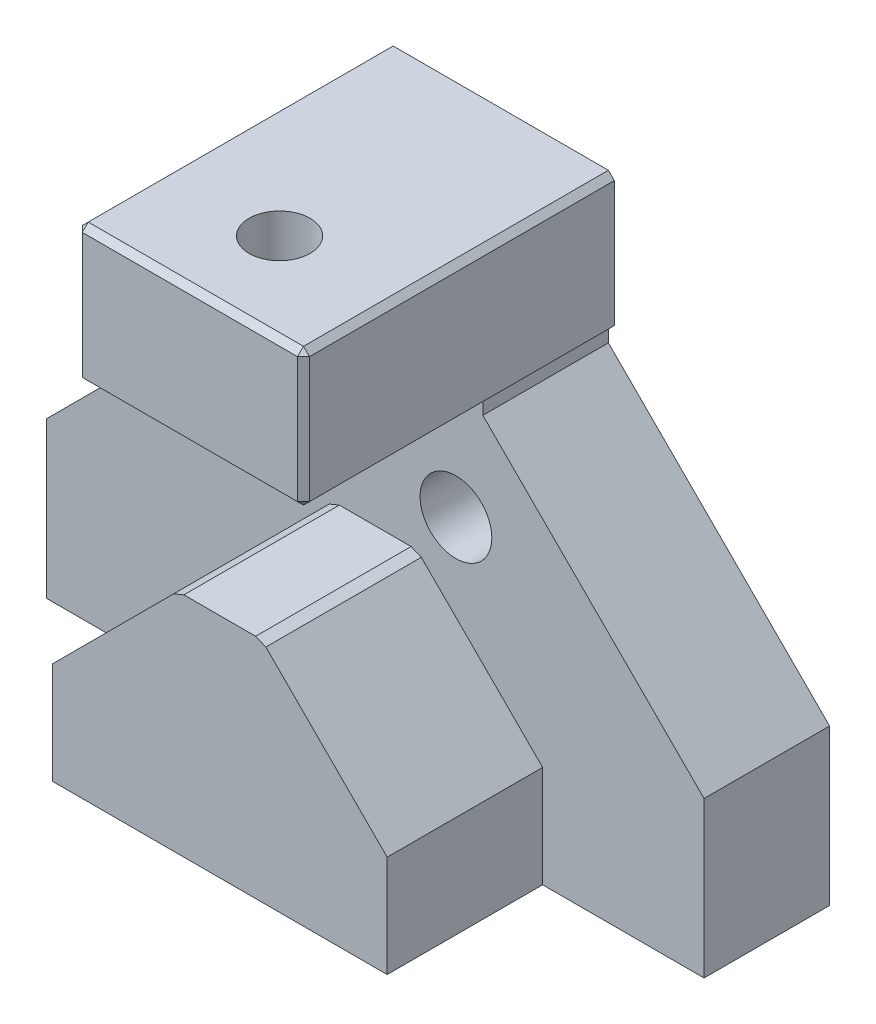
ISO-10303-21;
HEADER;
FILE_DESCRIPTION(('STEP AP214'),'2;1');
FILE_NAME('part.step','',(''),(''),'','','');
FILE_SCHEMA(('AUTOMOTIVE_DESIGN { 1 0 10303 214 1 1 1 1 }'));
ENDSEC;
DATA;
#1=APPLICATION_CONTEXT('core data for automotive mechanical design processes');
#2=APPLICATION_PROTOCOL_DEFINITION('international standard','automotive_design',2000,#1);
#3=PRODUCT_CONTEXT('',#1,'mechanical');
#4=PRODUCT('Part','Part','',(#3));
#5=PRODUCT_RELATED_PRODUCT_CATEGORY('part','',(#4));
#6=PRODUCT_DEFINITION_FORMATION('','',#4);
#7=PRODUCT_DEFINITION_CONTEXT('part definition',#1,'design');
#8=PRODUCT_DEFINITION('design','',#6,#7);
#9=PRODUCT_DEFINITION_SHAPE('','',#8);
#10=(LENGTH_UNIT() NAMED_UNIT(*) SI_UNIT(.MILLI.,.METRE.));
#11=(NAMED_UNIT(*) PLANE_ANGLE_UNIT() SI_UNIT($,.RADIAN.));
#12=(NAMED_UNIT(*) SI_UNIT($,.STERADIAN.) SOLID_ANGLE_UNIT());
#13=UNCERTAINTY_MEASURE_WITH_UNIT(LENGTH_MEASURE(1.E-05),#10,'distance_accuracy_value','');
#14=(GEOMETRIC_REPRESENTATION_CONTEXT(3) GLOBAL_UNCERTAINTY_ASSIGNED_CONTEXT((#13)) GLOBAL_UNIT_ASSIGNED_CONTEXT((#10,
#11,#12)) REPRESENTATION_CONTEXT('',''));
#15=CARTESIAN_POINT('',(0.,0.,0.));
#16=DIRECTION('',(0.,0.,1.));
#17=DIRECTION('',(1.,0.,0.));
#18=AXIS2_PLACEMENT_3D('',#15,#16,#17);
#19=CARTESIAN_POINT('',(-19.,0.,21.));
#20=DIRECTION('',(0.,-1.,0.));
#21=DIRECTION('',(1.,0.,0.));
#22=AXIS2_PLACEMENT_3D('',#19,#20,#21);
#23=PLANE('',#22);
#24=DIRECTION('',(1.,0.,0.));
#25=VECTOR('',#24,1.);
#26=CARTESIAN_POINT('',(-19.,0.,51.));
#27=LINE('',#26,#25);
#28=CARTESIAN_POINT('',(-18.,0.,51.));
#29=VERTEX_POINT('',#28);
#30=CARTESIAN_POINT('',(18.,0.,51.));
#31=VERTEX_POINT('',#30);
#32=EDGE_CURVE('E376',#29,#31,#27,.T.);
#33=ORIENTED_EDGE('',*,*,#32,.T.);
#34=DIRECTION('',(0.,0.,-1.));
#35=VECTOR('',#34,1.);
#36=CARTESIAN_POINT('',(18.,0.,21.));
#37=LINE('',#36,#35);
#38=CARTESIAN_POINT('',(18.,0.,0.));
#39=VERTEX_POINT('',#38);
#40=EDGE_CURVE('E378',#31,#39,#37,.T.);
#41=ORIENTED_EDGE('',*,*,#40,.T.);
#42=DIRECTION('',(-1.,0.,0.));
#43=VECTOR('',#42,1.);
#44=CARTESIAN_POINT('',(-19.,0.,0.));
#45=LINE('',#44,#43);
#46=CARTESIAN_POINT('',(-18.,0.,0.));
#47=VERTEX_POINT('',#46);
#48=EDGE_CURVE('E296',#39,#47,#45,.T.);
#49=ORIENTED_EDGE('',*,*,#48,.T.);
#50=DIRECTION('',(0.,0.,1.));
#51=VECTOR('',#50,1.);
#52=CARTESIAN_POINT('',(-18.,0.,21.));
#53=LINE('',#52,#51);
#54=EDGE_CURVE('E374',#47,#29,#53,.T.);
#55=ORIENTED_EDGE('',*,*,#54,.T.);
#56=EDGE_LOOP('',(#33,#41,#49,#55));
#57=FACE_BOUND('',#56,.T.);
#58=CARTESIAN_POINT('',(0.,0.,37.));
#59=DIRECTION('',(0.,1.,0.));
#60=DIRECTION('',(0.,0.,1.));
#61=AXIS2_PLACEMENT_3D('',#58,#59,#60);
#62=CIRCLE('',#61,5.09999999999999);
#63=CARTESIAN_POINT('',(0.,0.,42.1));
#64=VERTEX_POINT('',#63);
#65=EDGE_CURVE('E964',#64,#64,#62,.T.);
#66=ORIENTED_EDGE('',*,*,#65,.F.);
#67=EDGE_LOOP('',(#66));
#68=FACE_BOUND('',#67,.T.);
#69=ADVANCED_FACE('F53',(#57,#68),#23,.F.);
#70=CARTESIAN_POINT('',(0.,0.,21.));
#71=DIRECTION('',(0.,0.,-1.));
#72=DIRECTION('',(-1.,0.,0.));
#73=AXIS2_PLACEMENT_3D('',#70,#71,#72);
#74=PLANE('',#73);
#75=CARTESIAN_POINT('',(-13.5,-42.,21.));
#76=DIRECTION('',(0.,0.,1.));
#77=DIRECTION('',(1.,0.,0.));
#78=AXIS2_PLACEMENT_3D('',#75,#76,#77);
#79=CIRCLE('',#78,6.);
#80=CARTESIAN_POINT('',(-7.5,-42.,21.));
#81=VERTEX_POINT('',#80);
#82=EDGE_CURVE('E976',#81,#81,#79,.T.);
#83=ORIENTED_EDGE('',*,*,#82,.F.);
#84=EDGE_LOOP('',(#83));
#85=FACE_BOUND('',#84,.T.);
#86=CARTESIAN_POINT('',(13.5,-42.,21.));
#87=DIRECTION('',(0.,0.,1.));
#88=DIRECTION('',(1.,0.,0.));
#89=AXIS2_PLACEMENT_3D('',#86,#87,#88);
#90=CIRCLE('',#89,6.);
#91=CARTESIAN_POINT('',(19.5,-42.,21.));
#92=VERTEX_POINT('',#91);
#93=EDGE_CURVE('E970',#92,#92,#90,.T.);
#94=ORIENTED_EDGE('',*,*,#93,.F.);
#95=EDGE_LOOP('',(#94));
#96=FACE_BOUND('',#95,.T.);
#97=DIRECTION('',(0.,-1.,0.));
#98=VECTOR('',#97,1.);
#99=CARTESIAN_POINT('',(-28.,-71.,21.));
#100=LINE('',#99,#98);
#101=CARTESIAN_POINT('',(-28.,-71.,21.));
#102=VERTEX_POINT('',#101);
#103=CARTESIAN_POINT('',(-28.,-88.,21.));
#104=VERTEX_POINT('',#103);
#105=EDGE_CURVE('E262',#102,#104,#100,.T.);
#106=ORIENTED_EDGE('',*,*,#105,.F.);
#107=DIRECTION('',(-0.707106781186546,-0.707106781186549,0.));
#108=VECTOR('',#107,1.);
#109=CARTESIAN_POINT('',(-7.00000000000008,-50.,21.));
#110=LINE('',#109,#108);
#111=CARTESIAN_POINT('',(-7.70710678118666,-50.7071067811866,21.));
#112=VERTEX_POINT('',#111);
#113=EDGE_CURVE('E237',#112,#102,#110,.T.);
#114=ORIENTED_EDGE('',*,*,#113,.F.);
#115=DIRECTION('',(-0.923879532511287,-0.382683432365089,0.));
#116=VECTOR('',#115,1.);
#117=CARTESIAN_POINT('',(16.7989898732233,-40.5563491861041,21.));
#118=LINE('',#117,#116);
#119=CARTESIAN_POINT('',(-6.00000000000003,-50.,21.));
#120=VERTEX_POINT('',#119);
#121=EDGE_CURVE('E62',#112,#120,#118,.F.);
#122=ORIENTED_EDGE('',*,*,#121,.T.);
#123=DIRECTION('',(-1.,0.,0.));
#124=VECTOR('',#123,1.);
#125=CARTESIAN_POINT('',(-7.00000000000008,-50.,21.));
#126=LINE('',#125,#124);
#127=CARTESIAN_POINT('',(6.00000000000011,-50.,21.));
#128=VERTEX_POINT('',#127);
#129=EDGE_CURVE('E257',#128,#120,#126,.T.);
#130=ORIENTED_EDGE('',*,*,#129,.F.);
#131=DIRECTION('',(-0.923879532511287,0.382683432365091,0.));
#132=VECTOR('',#131,1.);
#133=CARTESIAN_POINT('',(-16.7989898732233,-40.556349186104,21.));
#134=LINE('',#133,#132);
#135=CARTESIAN_POINT('',(7.70710678118663,-50.7071067811865,21.));
#136=VERTEX_POINT('',#135);
#137=EDGE_CURVE('E11',#128,#136,#134,.F.);
#138=ORIENTED_EDGE('',*,*,#137,.T.);
#139=DIRECTION('',(-0.707106781186546,0.707106781186549,0.));
#140=VECTOR('',#139,1.);
#141=CARTESIAN_POINT('',(7.00000000000009,-50.,21.));
#142=LINE('',#141,#140);
#143=CARTESIAN_POINT('',(28.,-71.,21.));
#144=VERTEX_POINT('',#143);
#145=EDGE_CURVE('E255',#144,#136,#142,.T.);
#146=ORIENTED_EDGE('',*,*,#145,.F.);
#147=DIRECTION('',(0.,1.,0.));
#148=VECTOR('',#147,1.);
#149=CARTESIAN_POINT('',(28.,-71.,21.));
#150=LINE('',#149,#148);
#151=CARTESIAN_POINT('',(28.,-88.,21.));
#152=VERTEX_POINT('',#151);
#153=EDGE_CURVE('E264',#152,#144,#150,.T.);
#154=ORIENTED_EDGE('',*,*,#153,.F.);
#155=DIRECTION('',(1.,0.,0.));
#156=VECTOR('',#155,1.);
#157=CARTESIAN_POINT('',(55.,-88.,21.));
#158=LINE('',#157,#156);
#159=CARTESIAN_POINT('',(55.,-88.,21.));
#160=VERTEX_POINT('',#159);
#161=EDGE_CURVE('E284',#152,#160,#158,.T.);
#162=ORIENTED_EDGE('',*,*,#161,.T.);
#163=DIRECTION('',(0.,1.,0.));
#164=VECTOR('',#163,1.);
#165=CARTESIAN_POINT('',(55.,-62.,21.));
#166=LINE('',#165,#164);
#167=CARTESIAN_POINT('',(55.,-62.,21.));
#168=VERTEX_POINT('',#167);
#169=EDGE_CURVE('E287',#160,#168,#166,.T.);
#170=ORIENTED_EDGE('',*,*,#169,.T.);
#171=DIRECTION('',(-0.707106781186546,0.707106781186549,0.));
#172=VECTOR('',#171,1.);
#173=CARTESIAN_POINT('',(18.,-24.9999999999998,21.));
#174=LINE('',#173,#172);
#175=CARTESIAN_POINT('',(18.,-24.9999999999998,21.));
#176=VERTEX_POINT('',#175);
#177=EDGE_CURVE('E289',#168,#176,#174,.T.);
#178=ORIENTED_EDGE('',*,*,#177,.T.);
#179=DIRECTION('',(0.,1.,0.));
#180=VECTOR('',#179,1.);
#181=CARTESIAN_POINT('',(18.,-23.,21.));
#182=LINE('',#181,#180);
#183=CARTESIAN_POINT('',(18.,-23.,21.));
#184=VERTEX_POINT('',#183);
#185=EDGE_CURVE('E291',#176,#184,#182,.T.);
#186=ORIENTED_EDGE('',*,*,#185,.T.);
#187=DIRECTION('',(-1.,0.,0.));
#188=VECTOR('',#187,1.);
#189=CARTESIAN_POINT('',(0.,-23.,21.));
#190=LINE('',#189,#188);
#191=CARTESIAN_POINT('',(-18.,-23.,21.));
#192=VERTEX_POINT('',#191);
#193=EDGE_CURVE('E241',#184,#192,#190,.T.);
#194=ORIENTED_EDGE('',*,*,#193,.T.);
#195=DIRECTION('',(0.,-1.,0.));
#196=VECTOR('',#195,1.);
#197=CARTESIAN_POINT('',(-18.,-23.,21.));
#198=LINE('',#197,#196);
#199=CARTESIAN_POINT('',(-18.,-24.9999999999999,21.));
#200=VERTEX_POINT('',#199);
#201=EDGE_CURVE('E277',#192,#200,#198,.T.);
#202=ORIENTED_EDGE('',*,*,#201,.T.);
#203=DIRECTION('',(-0.707106781186546,-0.707106781186549,0.));
#204=VECTOR('',#203,1.);
#205=CARTESIAN_POINT('',(-18.,-24.9999999999999,21.));
#206=LINE('',#205,#204);
#207=CARTESIAN_POINT('',(-55.,-62.,21.));
#208=VERTEX_POINT('',#207);
#209=EDGE_CURVE('E279',#200,#208,#206,.T.);
#210=ORIENTED_EDGE('',*,*,#209,.T.);
#211=DIRECTION('',(0.,-1.,0.));
#212=VECTOR('',#211,1.);
#213=CARTESIAN_POINT('',(-55.,-62.,21.));
#214=LINE('',#213,#212);
#215=CARTESIAN_POINT('',(-55.,-88.,21.));
#216=VERTEX_POINT('',#215);
#217=EDGE_CURVE('E282',#208,#216,#214,.T.);
#218=ORIENTED_EDGE('',*,*,#217,.T.);
#219=EDGE_CURVE('E285',#216,#104,#158,.T.);
#220=ORIENTED_EDGE('',*,*,#219,.T.);
#221=EDGE_LOOP('',(#106,#114,#122,#130,#138,#146,#154,#162,#170,#178,#186,#194,#202,#210,#218,#220));
#222=FACE_BOUND('',#221,.T.);
#223=ADVANCED_FACE('F424',(#85,#96,#222),#74,.F.);
#224=CARTESIAN_POINT('',(19.,0.,21.));
#225=DIRECTION('',(-1.,0.,0.));
#226=DIRECTION('',(0.,-1.,0.));
#227=AXIS2_PLACEMENT_3D('',#224,#225,#226);
#228=PLANE('',#227);
#229=DIRECTION('',(0.,-1.,0.));
#230=VECTOR('',#229,1.);
#231=CARTESIAN_POINT('',(19.,0.,51.));
#232=LINE('',#231,#230);
#233=CARTESIAN_POINT('',(19.,-1.00000000000001,51.));
#234=VERTEX_POINT('',#233);
#235=CARTESIAN_POINT('',(19.,-22.,51.));
#236=VERTEX_POINT('',#235);
#237=EDGE_CURVE('E370',#234,#236,#232,.T.);
#238=ORIENTED_EDGE('',*,*,#237,.T.);
#239=DIRECTION('',(0.,0.,-1.));
#240=VECTOR('',#239,1.);
#241=CARTESIAN_POINT('',(19.,-22.,21.));
#242=LINE('',#241,#240);
#243=CARTESIAN_POINT('',(19.,-22.,0.));
#244=VERTEX_POINT('',#243);
#245=EDGE_CURVE('E372',#236,#244,#242,.T.);
#246=ORIENTED_EDGE('',*,*,#245,.T.);
#247=DIRECTION('',(0.,1.,0.));
#248=VECTOR('',#247,1.);
#249=CARTESIAN_POINT('',(19.,0.,0.));
#250=LINE('',#249,#248);
#251=CARTESIAN_POINT('',(19.,-1.00000000000001,0.));
#252=VERTEX_POINT('',#251);
#253=EDGE_CURVE('E276',#244,#252,#250,.T.);
#254=ORIENTED_EDGE('',*,*,#253,.T.);
#255=DIRECTION('',(0.,0.,1.));
#256=VECTOR('',#255,1.);
#257=CARTESIAN_POINT('',(19.,-1.00000000000001,21.));
#258=LINE('',#257,#256);
#259=EDGE_CURVE('E368',#252,#234,#258,.T.);
#260=ORIENTED_EDGE('',*,*,#259,.T.);
#261=EDGE_LOOP('',(#238,#246,#254,#260));
#262=FACE_BOUND('',#261,.T.);
#263=ADVANCED_FACE('F450',(#262),#228,.F.);
#264=CARTESIAN_POINT('',(-19.,0.,21.));
#265=DIRECTION('',(1.,0.,0.));
#266=DIRECTION('',(0.,1.,0.));
#267=AXIS2_PLACEMENT_3D('',#264,#265,#266);
#268=PLANE('',#267);
#269=DIRECTION('',(0.,-1.,0.));
#270=VECTOR('',#269,1.);
#271=CARTESIAN_POINT('',(-19.,0.,0.));
#272=LINE('',#271,#270);
#273=CARTESIAN_POINT('',(-19.,-1.00000000000002,0.));
#274=VERTEX_POINT('',#273);
#275=CARTESIAN_POINT('',(-19.,-22.,0.));
#276=VERTEX_POINT('',#275);
#277=EDGE_CURVE('E299',#274,#276,#272,.T.);
#278=ORIENTED_EDGE('',*,*,#277,.T.);
#279=DIRECTION('',(0.,0.,1.));
#280=VECTOR('',#279,1.);
#281=CARTESIAN_POINT('',(-19.,-22.,21.));
#282=LINE('',#281,#280);
#283=CARTESIAN_POINT('',(-19.,-22.,51.));
#284=VERTEX_POINT('',#283);
#285=EDGE_CURVE('E366',#276,#284,#282,.T.);
#286=ORIENTED_EDGE('',*,*,#285,.T.);
#287=DIRECTION('',(0.,1.,0.));
#288=VECTOR('',#287,1.);
#289=CARTESIAN_POINT('',(-19.,0.,51.));
#290=LINE('',#289,#288);
#291=CARTESIAN_POINT('',(-19.,-1.00000000000002,51.));
#292=VERTEX_POINT('',#291);
#293=EDGE_CURVE('E364',#284,#292,#290,.T.);
#294=ORIENTED_EDGE('',*,*,#293,.T.);
#295=DIRECTION('',(0.,0.,-1.));
#296=VECTOR('',#295,1.);
#297=CARTESIAN_POINT('',(-19.,-1.00000000000002,21.));
#298=LINE('',#297,#296);
#299=EDGE_CURVE('E362',#292,#274,#298,.T.);
#300=ORIENTED_EDGE('',*,*,#299,.T.);
#301=EDGE_LOOP('',(#278,#286,#294,#300));
#302=FACE_BOUND('',#301,.T.);
#303=ADVANCED_FACE('F456',(#302),#268,.F.);
#304=CARTESIAN_POINT('',(-18.,-23.,21.));
#305=DIRECTION('',(1.,0.,0.));
#306=DIRECTION('',(0.,0.,-1.));
#307=AXIS2_PLACEMENT_3D('',#304,#305,#306);
#308=PLANE('',#307);
#309=DIRECTION('',(0.,-1.,0.));
#310=VECTOR('',#309,1.);
#311=CARTESIAN_POINT('',(-18.,-23.,0.));
#312=LINE('',#311,#310);
#313=CARTESIAN_POINT('',(-18.,-23.,0.));
#314=VERTEX_POINT('',#313);
#315=CARTESIAN_POINT('',(-18.,-24.9999999999999,0.));
#316=VERTEX_POINT('',#315);
#317=EDGE_CURVE('E302',#314,#316,#312,.T.);
#318=ORIENTED_EDGE('',*,*,#317,.T.);
#319=DIRECTION('',(0.,0.,-1.));
#320=VECTOR('',#319,1.);
#321=CARTESIAN_POINT('',(-18.,-24.9999999999999,21.));
#322=LINE('',#321,#320);
#323=EDGE_CURVE('E333',#200,#316,#322,.T.);
#324=ORIENTED_EDGE('',*,*,#323,.F.);
#325=ORIENTED_EDGE('',*,*,#201,.F.);
#326=DIRECTION('',(0.,0.,-1.));
#327=VECTOR('',#326,1.);
#328=CARTESIAN_POINT('',(-18.,-23.,21.));
#329=LINE('',#328,#327);
#330=EDGE_CURVE('E336',#192,#314,#329,.T.);
#331=ORIENTED_EDGE('',*,*,#330,.T.);
#332=EDGE_LOOP('',(#318,#324,#325,#331));
#333=FACE_BOUND('',#332,.T.);
#334=ADVANCED_FACE('F573',(#333),#308,.F.);
#335=CARTESIAN_POINT('',(-18.,-24.9999999999999,21.));
#336=DIRECTION('',(0.707106781186549,-0.707106781186546,0.));
#337=DIRECTION('',(0.707106781186546,0.707106781186549,0.));
#338=AXIS2_PLACEMENT_3D('',#335,#336,#337);
#339=PLANE('',#338);
#340=DIRECTION('',(-0.707106781186546,-0.707106781186549,0.));
#341=VECTOR('',#340,1.);
#342=CARTESIAN_POINT('',(-18.,-24.9999999999999,0.));
#343=LINE('',#342,#341);
#344=CARTESIAN_POINT('',(-55.,-62.,0.));
#345=VERTEX_POINT('',#344);
#346=EDGE_CURVE('E304',#316,#345,#343,.T.);
#347=ORIENTED_EDGE('',*,*,#346,.T.);
#348=DIRECTION('',(0.,0.,-1.));
#349=VECTOR('',#348,1.);
#350=CARTESIAN_POINT('',(-55.,-62.,21.));
#351=LINE('',#350,#349);
#352=EDGE_CURVE('E330',#208,#345,#351,.T.);
#353=ORIENTED_EDGE('',*,*,#352,.F.);
#354=ORIENTED_EDGE('',*,*,#209,.F.);
#355=ORIENTED_EDGE('',*,*,#323,.T.);
#356=EDGE_LOOP('',(#347,#353,#354,#355));
#357=FACE_BOUND('',#356,.T.);
#358=ADVANCED_FACE('F570',(#357),#339,.F.);
#359=CARTESIAN_POINT('',(-55.,-62.,21.));
#360=DIRECTION('',(1.,0.,0.));
#361=DIRECTION('',(0.,1.,0.));
#362=AXIS2_PLACEMENT_3D('',#359,#360,#361);
#363=PLANE('',#362);
#364=DIRECTION('',(0.,-1.,0.));
#365=VECTOR('',#364,1.);
#366=CARTESIAN_POINT('',(-55.,-62.,0.));
#367=LINE('',#366,#365);
#368=CARTESIAN_POINT('',(-55.,-88.,0.));
#369=VERTEX_POINT('',#368);
#370=EDGE_CURVE('E306',#345,#369,#367,.T.);
#371=ORIENTED_EDGE('',*,*,#370,.T.);
#372=DIRECTION('',(0.,0.,-1.));
#373=VECTOR('',#372,1.);
#374=CARTESIAN_POINT('',(-55.,-88.,21.));
#375=LINE('',#374,#373);
#376=EDGE_CURVE('E327',#216,#369,#375,.T.);
#377=ORIENTED_EDGE('',*,*,#376,.F.);
#378=ORIENTED_EDGE('',*,*,#217,.F.);
#379=ORIENTED_EDGE('',*,*,#352,.T.);
#380=EDGE_LOOP('',(#371,#377,#378,#379));
#381=FACE_BOUND('',#380,.T.);
#382=ADVANCED_FACE('F565',(#381),#363,.F.);
#383=CARTESIAN_POINT('',(55.,-88.,21.));
#384=DIRECTION('',(0.,1.,0.));
#385=DIRECTION('',(-1.,0.,0.));
#386=AXIS2_PLACEMENT_3D('',#383,#384,#385);
#387=PLANE('',#386);
#388=DIRECTION('',(1.,0.,0.));
#389=VECTOR('',#388,1.);
#390=CARTESIAN_POINT('',(55.,-88.,0.));
#391=LINE('',#390,#389);
#392=CARTESIAN_POINT('',(55.,-88.,0.));
#393=VERTEX_POINT('',#392);
#394=EDGE_CURVE('E308',#369,#393,#391,.T.);
#395=ORIENTED_EDGE('',*,*,#394,.T.);
#396=DIRECTION('',(0.,0.,-1.));
#397=VECTOR('',#396,1.);
#398=CARTESIAN_POINT('',(55.,-88.,21.));
#399=LINE('',#398,#397);
#400=EDGE_CURVE('E324',#160,#393,#399,.T.);
#401=ORIENTED_EDGE('',*,*,#400,.F.);
#402=ORIENTED_EDGE('',*,*,#161,.F.);
#403=DIRECTION('',(0.,0.,-1.));
#404=VECTOR('',#403,1.);
#405=CARTESIAN_POINT('',(28.,-88.,47.));
#406=LINE('',#405,#404);
#407=CARTESIAN_POINT('',(28.,-88.,47.));
#408=VERTEX_POINT('',#407);
#409=EDGE_CURVE('E270',#408,#152,#406,.T.);
#410=ORIENTED_EDGE('',*,*,#409,.F.);
#411=DIRECTION('',(1.,0.,0.));
#412=VECTOR('',#411,1.);
#413=CARTESIAN_POINT('',(28.,-88.,47.));
#414=LINE('',#413,#412);
#415=CARTESIAN_POINT('',(-28.,-88.,47.));
#416=VERTEX_POINT('',#415);
#417=EDGE_CURVE('E247',#416,#408,#414,.T.);
#418=ORIENTED_EDGE('',*,*,#417,.F.);
#419=DIRECTION('',(0.,0.,-1.));
#420=VECTOR('',#419,1.);
#421=CARTESIAN_POINT('',(-28.,-88.,47.));
#422=LINE('',#421,#420);
#423=EDGE_CURVE('E242',#416,#104,#422,.T.);
#424=ORIENTED_EDGE('',*,*,#423,.T.);
#425=ORIENTED_EDGE('',*,*,#219,.F.);
#426=ORIENTED_EDGE('',*,*,#376,.T.);
#427=EDGE_LOOP('',(#395,#401,#402,#410,#418,#424,#425,#426));
#428=FACE_BOUND('',#427,.T.);
#429=ADVANCED_FACE('F558',(#428),#387,.F.);
#430=CARTESIAN_POINT('',(55.,-62.,21.));
#431=DIRECTION('',(-1.,0.,0.));
#432=DIRECTION('',(0.,-1.,0.));
#433=AXIS2_PLACEMENT_3D('',#430,#431,#432);
#434=PLANE('',#433);
#435=DIRECTION('',(0.,1.,0.));
#436=VECTOR('',#435,1.);
#437=CARTESIAN_POINT('',(55.,-62.,0.));
#438=LINE('',#437,#436);
#439=CARTESIAN_POINT('',(55.,-62.,0.));
#440=VERTEX_POINT('',#439);
#441=EDGE_CURVE('E310',#393,#440,#438,.T.);
#442=ORIENTED_EDGE('',*,*,#441,.T.);
#443=DIRECTION('',(0.,0.,-1.));
#444=VECTOR('',#443,1.);
#445=CARTESIAN_POINT('',(55.,-62.,21.));
#446=LINE('',#445,#444);
#447=EDGE_CURVE('E321',#168,#440,#446,.T.);
#448=ORIENTED_EDGE('',*,*,#447,.F.);
#449=ORIENTED_EDGE('',*,*,#169,.F.);
#450=ORIENTED_EDGE('',*,*,#400,.T.);
#451=EDGE_LOOP('',(#442,#448,#449,#450));
#452=FACE_BOUND('',#451,.T.);
#453=ADVANCED_FACE('F554',(#452),#434,.F.);
#454=CARTESIAN_POINT('',(18.,-24.9999999999998,21.));
#455=DIRECTION('',(-0.707106781186549,-0.707106781186546,0.));
#456=DIRECTION('',(0.707106781186546,-0.707106781186549,0.));
#457=AXIS2_PLACEMENT_3D('',#454,#455,#456);
#458=PLANE('',#457);
#459=DIRECTION('',(-0.707106781186546,0.707106781186549,0.));
#460=VECTOR('',#459,1.);
#461=CARTESIAN_POINT('',(18.,-24.9999999999998,0.));
#462=LINE('',#461,#460);
#463=CARTESIAN_POINT('',(18.,-24.9999999999998,0.));
#464=VERTEX_POINT('',#463);
#465=EDGE_CURVE('E312',#440,#464,#462,.T.);
#466=ORIENTED_EDGE('',*,*,#465,.T.);
#467=DIRECTION('',(0.,0.,-1.));
#468=VECTOR('',#467,1.);
#469=CARTESIAN_POINT('',(18.,-24.9999999999998,21.));
#470=LINE('',#469,#468);
#471=EDGE_CURVE('E318',#176,#464,#470,.T.);
#472=ORIENTED_EDGE('',*,*,#471,.F.);
#473=ORIENTED_EDGE('',*,*,#177,.F.);
#474=ORIENTED_EDGE('',*,*,#447,.T.);
#475=EDGE_LOOP('',(#466,#472,#473,#474));
#476=FACE_BOUND('',#475,.T.);
#477=ADVANCED_FACE('F549',(#476),#458,.F.);
#478=CARTESIAN_POINT('',(18.,-23.,21.));
#479=DIRECTION('',(-1.,0.,0.));
#480=DIRECTION('',(0.,0.,1.));
#481=AXIS2_PLACEMENT_3D('',#478,#479,#480);
#482=PLANE('',#481);
#483=DIRECTION('',(0.,1.,0.));
#484=VECTOR('',#483,1.);
#485=CARTESIAN_POINT('',(18.,-23.,0.));
#486=LINE('',#485,#484);
#487=CARTESIAN_POINT('',(18.,-23.,0.));
#488=VERTEX_POINT('',#487);
#489=EDGE_CURVE('E280',#464,#488,#486,.T.);
#490=ORIENTED_EDGE('',*,*,#489,.T.);
#491=DIRECTION('',(0.,0.,-1.));
#492=VECTOR('',#491,1.);
#493=CARTESIAN_POINT('',(18.,-23.,21.));
#494=LINE('',#493,#492);
#495=EDGE_CURVE('E293',#184,#488,#494,.T.);
#496=ORIENTED_EDGE('',*,*,#495,.F.);
#497=ORIENTED_EDGE('',*,*,#185,.F.);
#498=ORIENTED_EDGE('',*,*,#471,.T.);
#499=EDGE_LOOP('',(#490,#496,#497,#498));
#500=FACE_BOUND('',#499,.T.);
#501=ADVANCED_FACE('F542',(#500),#482,.F.);
#502=CARTESIAN_POINT('',(19.,-23.,21.));
#503=DIRECTION('',(0.,1.,0.));
#504=DIRECTION('',(0.,0.,1.));
#505=AXIS2_PLACEMENT_3D('',#502,#503,#504);
#506=PLANE('',#505);
#507=CARTESIAN_POINT('',(0.,-23.,37.));
#508=DIRECTION('',(0.,1.,0.));
#509=DIRECTION('',(0.,0.,1.));
#510=AXIS2_PLACEMENT_3D('',#507,#508,#509);
#511=CIRCLE('',#510,5.09999999999999);
#512=CARTESIAN_POINT('',(0.,-23.,42.1));
#513=VERTEX_POINT('',#512);
#514=EDGE_CURVE('E384',#513,#513,#511,.T.);
#515=ORIENTED_EDGE('',*,*,#514,.T.);
#516=EDGE_LOOP('',(#515));
#517=FACE_BOUND('',#516,.T.);
#518=DIRECTION('',(-1.,0.,0.));
#519=VECTOR('',#518,1.);
#520=CARTESIAN_POINT('',(19.,-23.,51.));
#521=LINE('',#520,#519);
#522=CARTESIAN_POINT('',(18.,-23.,51.));
#523=VERTEX_POINT('',#522);
#524=CARTESIAN_POINT('',(-18.,-23.,51.));
#525=VERTEX_POINT('',#524);
#526=EDGE_CURVE('E340',#523,#525,#521,.T.);
#527=ORIENTED_EDGE('',*,*,#526,.T.);
#528=DIRECTION('',(0.,0.,-1.));
#529=VECTOR('',#528,1.);
#530=CARTESIAN_POINT('',(-18.,-23.,21.));
#531=LINE('',#530,#529);
#532=EDGE_CURVE('E343',#525,#192,#531,.T.);
#533=ORIENTED_EDGE('',*,*,#532,.T.);
#534=ORIENTED_EDGE('',*,*,#193,.F.);
#535=DIRECTION('',(0.,0.,1.));
#536=VECTOR('',#535,1.);
#537=CARTESIAN_POINT('',(18.,-23.,21.));
#538=LINE('',#537,#536);
#539=EDGE_CURVE('E338',#184,#523,#538,.T.);
#540=ORIENTED_EDGE('',*,*,#539,.T.);
#541=EDGE_LOOP('',(#527,#533,#534,#540));
#542=FACE_BOUND('',#541,.T.);
#543=ADVANCED_FACE('F535',(#517,#542),#506,.F.);
#544=CARTESIAN_POINT('',(0.,0.,0.));
#545=DIRECTION('',(0.,0.,-1.));
#546=DIRECTION('',(-1.,0.,0.));
#547=AXIS2_PLACEMENT_3D('',#544,#545,#546);
#548=PLANE('',#547);
#549=CARTESIAN_POINT('',(-13.5,-42.,0.));
#550=DIRECTION('',(0.,0.,1.));
#551=DIRECTION('',(1.,0.,0.));
#552=AXIS2_PLACEMENT_3D('',#549,#550,#551);
#553=CIRCLE('',#552,5.99999999999999);
#554=CARTESIAN_POINT('',(-7.5,-42.,0.));
#555=VERTEX_POINT('',#554);
#556=EDGE_CURVE('E973',#555,#555,#553,.T.);
#557=ORIENTED_EDGE('',*,*,#556,.T.);
#558=EDGE_LOOP('',(#557));
#559=FACE_BOUND('',#558,.T.);
#560=CARTESIAN_POINT('',(13.5,-42.,0.));
#561=DIRECTION('',(0.,0.,1.));
#562=DIRECTION('',(1.,0.,0.));
#563=AXIS2_PLACEMENT_3D('',#560,#561,#562);
#564=CIRCLE('',#563,5.99999999999999);
#565=CARTESIAN_POINT('',(19.5,-42.,0.));
#566=VERTEX_POINT('',#565);
#567=EDGE_CURVE('E967',#566,#566,#564,.T.);
#568=ORIENTED_EDGE('',*,*,#567,.T.);
#569=EDGE_LOOP('',(#568));
#570=FACE_BOUND('',#569,.T.);
#571=ORIENTED_EDGE('',*,*,#317,.F.);
#572=DIRECTION('',(0.707106781186546,-0.707106781186549,0.));
#573=VECTOR('',#572,1.);
#574=CARTESIAN_POINT('',(-20.5,-20.5,0.));
#575=LINE('',#574,#573);
#576=EDGE_CURVE('E360',#314,#276,#575,.F.);
#577=ORIENTED_EDGE('',*,*,#576,.T.);
#578=ORIENTED_EDGE('',*,*,#277,.F.);
#579=DIRECTION('',(-0.707106781186548,-0.707106781186547,0.));
#580=VECTOR('',#579,1.);
#581=CARTESIAN_POINT('',(-8.99999999999998,8.99999999999999,0.));
#582=LINE('',#581,#580);
#583=EDGE_CURVE('E354',#274,#47,#582,.F.);
#584=ORIENTED_EDGE('',*,*,#583,.T.);
#585=ORIENTED_EDGE('',*,*,#48,.F.);
#586=DIRECTION('',(-0.70710678118655,0.707106781186545,0.));
#587=VECTOR('',#586,1.);
#588=CARTESIAN_POINT('',(8.99999999999991,8.99999999999999,0.));
#589=LINE('',#588,#587);
#590=EDGE_CURVE('E356',#39,#252,#589,.F.);
#591=ORIENTED_EDGE('',*,*,#590,.T.);
#592=ORIENTED_EDGE('',*,*,#253,.F.);
#593=DIRECTION('',(0.707106781186546,0.707106781186549,0.));
#594=VECTOR('',#593,1.);
#595=CARTESIAN_POINT('',(20.5,-20.5,0.));
#596=LINE('',#595,#594);
#597=EDGE_CURVE('E358',#244,#488,#596,.F.);
#598=ORIENTED_EDGE('',*,*,#597,.T.);
#599=ORIENTED_EDGE('',*,*,#489,.F.);
#600=ORIENTED_EDGE('',*,*,#465,.F.);
#601=ORIENTED_EDGE('',*,*,#441,.F.);
#602=ORIENTED_EDGE('',*,*,#394,.F.);
#603=ORIENTED_EDGE('',*,*,#370,.F.);
#604=ORIENTED_EDGE('',*,*,#346,.F.);
#605=EDGE_LOOP('',(#571,#577,#578,#584,#585,#591,#592,#598,#599,#600,#601,#602,#603,#604));
#606=FACE_BOUND('',#605,.T.);
#607=ADVANCED_FACE('F522',(#559,#570,#606),#548,.T.);
#608=CARTESIAN_POINT('',(0.,0.,52.));
#609=DIRECTION('',(0.,0.,-1.));
#610=DIRECTION('',(-1.,0.,0.));
#611=AXIS2_PLACEMENT_3D('',#608,#609,#610);
#612=PLANE('',#611);
#613=DIRECTION('',(0.,-1.,0.));
#614=VECTOR('',#613,1.);
#615=CARTESIAN_POINT('',(-18.,0.,52.));
#616=LINE('',#615,#614);
#617=CARTESIAN_POINT('',(-18.,-1.00000000000002,52.));
#618=VERTEX_POINT('',#617);
#619=CARTESIAN_POINT('',(-18.,-22.,52.));
#620=VERTEX_POINT('',#619);
#621=EDGE_CURVE('E349',#618,#620,#616,.T.);
#622=ORIENTED_EDGE('',*,*,#621,.T.);
#623=DIRECTION('',(1.,0.,0.));
#624=VECTOR('',#623,1.);
#625=CARTESIAN_POINT('',(0.,-22.,52.));
#626=LINE('',#625,#624);
#627=CARTESIAN_POINT('',(18.,-22.,52.));
#628=VERTEX_POINT('',#627);
#629=EDGE_CURVE('E351',#620,#628,#626,.T.);
#630=ORIENTED_EDGE('',*,*,#629,.T.);
#631=DIRECTION('',(0.,1.,0.));
#632=VECTOR('',#631,1.);
#633=CARTESIAN_POINT('',(18.,0.,52.));
#634=LINE('',#633,#632);
#635=CARTESIAN_POINT('',(18.,-1.00000000000001,52.));
#636=VERTEX_POINT('',#635);
#637=EDGE_CURVE('E347',#628,#636,#634,.T.);
#638=ORIENTED_EDGE('',*,*,#637,.T.);
#639=DIRECTION('',(-1.,0.,0.));
#640=VECTOR('',#639,1.);
#641=CARTESIAN_POINT('',(0.,-1.00000000000002,52.));
#642=LINE('',#641,#640);
#643=EDGE_CURVE('E345',#636,#618,#642,.T.);
#644=ORIENTED_EDGE('',*,*,#643,.T.);
#645=EDGE_LOOP('',(#622,#630,#638,#644));
#646=FACE_BOUND('',#645,.T.);
#647=ADVANCED_FACE('F593',(#646),#612,.F.);
#648=CARTESIAN_POINT('',(7.00000000000009,-50.,47.));
#649=DIRECTION('',(-0.707106781186549,-0.707106781186546,0.));
#650=DIRECTION('',(0.707106781186546,-0.707106781186549,0.));
#651=AXIS2_PLACEMENT_3D('',#648,#649,#650);
#652=PLANE('',#651);
#653=ORIENTED_EDGE('',*,*,#145,.T.);
#654=DIRECTION('',(0.,0.,1.));
#655=VECTOR('',#654,1.);
#656=CARTESIAN_POINT('',(7.70710678118663,-50.7071067811865,47.));
#657=LINE('',#656,#655);
#658=CARTESIAN_POINT('',(7.70710678118663,-50.7071067811865,47.));
#659=VERTEX_POINT('',#658);
#660=EDGE_CURVE('E74',#136,#659,#657,.T.);
#661=ORIENTED_EDGE('',*,*,#660,.T.);
#662=DIRECTION('',(-0.707106781186546,0.707106781186549,0.));
#663=VECTOR('',#662,1.);
#664=CARTESIAN_POINT('',(7.00000000000009,-50.,47.));
#665=LINE('',#664,#663);
#666=CARTESIAN_POINT('',(28.,-71.,47.));
#667=VERTEX_POINT('',#666);
#668=EDGE_CURVE('E267',#667,#659,#665,.T.);
#669=ORIENTED_EDGE('',*,*,#668,.F.);
#670=DIRECTION('',(0.,0.,-1.));
#671=VECTOR('',#670,1.);
#672=CARTESIAN_POINT('',(28.,-71.,47.));
#673=LINE('',#672,#671);
#674=EDGE_CURVE('E254',#667,#144,#673,.T.);
#675=ORIENTED_EDGE('',*,*,#674,.T.);
#676=EDGE_LOOP('',(#653,#661,#669,#675));
#677=FACE_BOUND('',#676,.T.);
#678=ADVANCED_FACE('F595',(#677),#652,.F.);
#679=CARTESIAN_POINT('',(-7.00000000000008,-50.,47.));
#680=DIRECTION('',(0.,-1.,0.));
#681=DIRECTION('',(0.,0.,-1.));
#682=AXIS2_PLACEMENT_3D('',#679,#680,#681);
#683=PLANE('',#682);
#684=ORIENTED_EDGE('',*,*,#129,.T.);
#685=DIRECTION('',(0.,0.,1.));
#686=VECTOR('',#685,1.);
#687=CARTESIAN_POINT('',(-6.00000000000003,-50.,47.));
#688=LINE('',#687,#686);
#689=CARTESIAN_POINT('',(-6.00000000000003,-50.,47.));
#690=VERTEX_POINT('',#689);
#691=EDGE_CURVE('E419',#120,#690,#688,.T.);
#692=ORIENTED_EDGE('',*,*,#691,.T.);
#693=DIRECTION('',(-1.,0.,0.));
#694=VECTOR('',#693,1.);
#695=CARTESIAN_POINT('',(-7.00000000000008,-50.,47.));
#696=LINE('',#695,#694);
#697=CARTESIAN_POINT('',(6.00000000000011,-50.,47.));
#698=VERTEX_POINT('',#697);
#699=EDGE_CURVE('E231',#698,#690,#696,.T.);
#700=ORIENTED_EDGE('',*,*,#699,.F.);
#701=DIRECTION('',(0.,0.,-1.));
#702=VECTOR('',#701,1.);
#703=CARTESIAN_POINT('',(6.00000000000011,-50.,47.));
#704=LINE('',#703,#702);
#705=EDGE_CURVE('E416',#698,#128,#704,.T.);
#706=ORIENTED_EDGE('',*,*,#705,.T.);
#707=EDGE_LOOP('',(#684,#692,#700,#706));
#708=FACE_BOUND('',#707,.T.);
#709=ADVANCED_FACE('F428',(#708),#683,.F.);
#710=CARTESIAN_POINT('',(-7.00000000000008,-50.,47.));
#711=DIRECTION('',(0.707106781186549,-0.707106781186546,0.));
#712=DIRECTION('',(0.707106781186546,0.707106781186549,0.));
#713=AXIS2_PLACEMENT_3D('',#710,#711,#712);
#714=PLANE('',#713);
#715=DIRECTION('',(-0.707106781186546,-0.707106781186549,0.));
#716=VECTOR('',#715,1.);
#717=CARTESIAN_POINT('',(-7.00000000000008,-50.,47.));
#718=LINE('',#717,#716);
#719=CARTESIAN_POINT('',(-7.70710678118666,-50.7071067811866,47.));
#720=VERTEX_POINT('',#719);
#721=CARTESIAN_POINT('',(-28.,-71.,47.));
#722=VERTEX_POINT('',#721);
#723=EDGE_CURVE('E219',#720,#722,#718,.T.);
#724=ORIENTED_EDGE('',*,*,#723,.F.);
#725=DIRECTION('',(0.,0.,-1.));
#726=VECTOR('',#725,1.);
#727=CARTESIAN_POINT('',(-7.70710678118666,-50.7071067811866,47.));
#728=LINE('',#727,#726);
#729=EDGE_CURVE('E380',#720,#112,#728,.T.);
#730=ORIENTED_EDGE('',*,*,#729,.T.);
#731=ORIENTED_EDGE('',*,*,#113,.T.);
#732=DIRECTION('',(0.,0.,-1.));
#733=VECTOR('',#732,1.);
#734=CARTESIAN_POINT('',(-28.,-71.,47.));
#735=LINE('',#734,#733);
#736=EDGE_CURVE('E234',#722,#102,#735,.T.);
#737=ORIENTED_EDGE('',*,*,#736,.F.);
#738=EDGE_LOOP('',(#724,#730,#731,#737));
#739=FACE_BOUND('',#738,.T.);
#740=ADVANCED_FACE('F235',(#739),#714,.F.);
#741=CARTESIAN_POINT('',(-28.,-71.,47.));
#742=DIRECTION('',(1.,0.,0.));
#743=DIRECTION('',(0.,1.,0.));
#744=AXIS2_PLACEMENT_3D('',#741,#742,#743);
#745=PLANE('',#744);
#746=ORIENTED_EDGE('',*,*,#105,.T.);
#747=ORIENTED_EDGE('',*,*,#423,.F.);
#748=DIRECTION('',(0.,-1.,0.));
#749=VECTOR('',#748,1.);
#750=CARTESIAN_POINT('',(-28.,-71.,47.));
#751=LINE('',#750,#749);
#752=EDGE_CURVE('E224',#722,#416,#751,.T.);
#753=ORIENTED_EDGE('',*,*,#752,.F.);
#754=ORIENTED_EDGE('',*,*,#736,.T.);
#755=EDGE_LOOP('',(#746,#747,#753,#754));
#756=FACE_BOUND('',#755,.T.);
#757=ADVANCED_FACE('F244',(#756),#745,.F.);
#758=CARTESIAN_POINT('',(28.,-71.,47.));
#759=DIRECTION('',(-1.,0.,0.));
#760=DIRECTION('',(0.,-1.,0.));
#761=AXIS2_PLACEMENT_3D('',#758,#759,#760);
#762=PLANE('',#761);
#763=ORIENTED_EDGE('',*,*,#153,.T.);
#764=ORIENTED_EDGE('',*,*,#674,.F.);
#765=DIRECTION('',(0.,1.,0.));
#766=VECTOR('',#765,1.);
#767=CARTESIAN_POINT('',(28.,-71.,47.));
#768=LINE('',#767,#766);
#769=EDGE_CURVE('E249',#408,#667,#768,.T.);
#770=ORIENTED_EDGE('',*,*,#769,.F.);
#771=ORIENTED_EDGE('',*,*,#409,.T.);
#772=EDGE_LOOP('',(#763,#764,#770,#771));
#773=FACE_BOUND('',#772,.T.);
#774=ADVANCED_FACE('F511',(#773),#762,.F.);
#775=CARTESIAN_POINT('',(0.,0.,47.));
#776=DIRECTION('',(0.,0.,-1.));
#777=DIRECTION('',(-1.,0.,0.));
#778=AXIS2_PLACEMENT_3D('',#775,#776,#777);
#779=PLANE('',#778);
#780=ORIENTED_EDGE('',*,*,#699,.T.);
#781=DIRECTION('',(0.923879532511287,0.382683432365089,0.));
#782=VECTOR('',#781,1.);
#783=CARTESIAN_POINT('',(-7.70710678118666,-50.7071067811866,47.));
#784=LINE('',#783,#782);
#785=EDGE_CURVE('E227',#690,#720,#784,.F.);
#786=ORIENTED_EDGE('',*,*,#785,.T.);
#787=ORIENTED_EDGE('',*,*,#723,.T.);
#788=ORIENTED_EDGE('',*,*,#752,.T.);
#789=ORIENTED_EDGE('',*,*,#417,.T.);
#790=ORIENTED_EDGE('',*,*,#769,.T.);
#791=ORIENTED_EDGE('',*,*,#668,.T.);
#792=DIRECTION('',(0.923879532511287,-0.382683432365091,0.));
#793=VECTOR('',#792,1.);
#794=CARTESIAN_POINT('',(6.00000000000011,-50.,47.));
#795=LINE('',#794,#793);
#796=EDGE_CURVE('E421',#659,#698,#795,.F.);
#797=ORIENTED_EDGE('',*,*,#796,.T.);
#798=EDGE_LOOP('',(#780,#786,#787,#788,#789,#790,#791,#797));
#799=FACE_BOUND('',#798,.T.);
#800=ADVANCED_FACE('F222',(#799),#779,.F.);
#801=CARTESIAN_POINT('',(18.,0.,21.));
#802=DIRECTION('',(-0.707106781186545,-0.70710678118655,0.));
#803=DIRECTION('',(0.,0.,-1.));
#804=AXIS2_PLACEMENT_3D('',#801,#802,#803);
#805=PLANE('',#804);
#806=ORIENTED_EDGE('',*,*,#590,.F.);
#807=ORIENTED_EDGE('',*,*,#40,.F.);
#808=DIRECTION('',(0.70710678118655,-0.707106781186545,0.));
#809=VECTOR('',#808,1.);
#810=CARTESIAN_POINT('',(18.5,-0.500000000000008,51.));
#811=LINE('',#810,#809);
#812=EDGE_CURVE('E410',#234,#31,#811,.F.);
#813=ORIENTED_EDGE('',*,*,#812,.F.);
#814=ORIENTED_EDGE('',*,*,#259,.F.);
#815=EDGE_LOOP('',(#806,#807,#813,#814));
#816=FACE_BOUND('',#815,.T.);
#817=ADVANCED_FACE('F504',(#816),#805,.F.);
#818=CARTESIAN_POINT('',(-19.,-1.00000000000002,21.));
#819=DIRECTION('',(0.707106781186547,-0.707106781186548,0.));
#820=DIRECTION('',(0.,0.,-1.));
#821=AXIS2_PLACEMENT_3D('',#818,#819,#820);
#822=PLANE('',#821);
#823=ORIENTED_EDGE('',*,*,#583,.F.);
#824=ORIENTED_EDGE('',*,*,#299,.F.);
#825=DIRECTION('',(0.707106781186548,0.707106781186547,0.));
#826=VECTOR('',#825,1.);
#827=CARTESIAN_POINT('',(-19.,-1.00000000000002,51.));
#828=LINE('',#827,#826);
#829=EDGE_CURVE('E407',#29,#292,#828,.F.);
#830=ORIENTED_EDGE('',*,*,#829,.F.);
#831=ORIENTED_EDGE('',*,*,#54,.F.);
#832=EDGE_LOOP('',(#823,#824,#830,#831));
#833=FACE_BOUND('',#832,.T.);
#834=ADVANCED_FACE('F501',(#833),#822,.F.);
#835=CARTESIAN_POINT('',(-19.,0.,51.));
#836=DIRECTION('',(0.,-0.707106781186548,-0.707106781186547));
#837=DIRECTION('',(1.,0.,0.));
#838=AXIS2_PLACEMENT_3D('',#835,#836,#837);
#839=PLANE('',#838);
#840=DIRECTION('',(0.,0.707106781186547,-0.707106781186548));
#841=VECTOR('',#840,1.);
#842=CARTESIAN_POINT('',(18.,-1.00000000000001,52.));
#843=LINE('',#842,#841);
#844=EDGE_CURVE('E258',#31,#636,#843,.F.);
#845=ORIENTED_EDGE('',*,*,#844,.F.);
#846=ORIENTED_EDGE('',*,*,#32,.F.);
#847=DIRECTION('',(0.,-0.707106781186547,0.707106781186548));
#848=VECTOR('',#847,1.);
#849=CARTESIAN_POINT('',(-18.,-0.500000000000013,51.5));
#850=LINE('',#849,#848);
#851=EDGE_CURVE('E404',#618,#29,#850,.F.);
#852=ORIENTED_EDGE('',*,*,#851,.F.);
#853=ORIENTED_EDGE('',*,*,#643,.F.);
#854=EDGE_LOOP('',(#845,#846,#852,#853));
#855=FACE_BOUND('',#854,.T.);
#856=ADVANCED_FACE('F497',(#855),#839,.F.);
#857=CARTESIAN_POINT('',(18.,-1.00000000000001,52.));
#858=DIRECTION('',(0.577350269189625,0.57735026918963,0.577350269189623));
#859=DIRECTION('',(-0.70710678118655,0.707106781186545,0.));
#860=AXIS2_PLACEMENT_3D('',#857,#858,#859);
#861=PLANE('',#860);
#862=ORIENTED_EDGE('',*,*,#812,.T.);
#863=ORIENTED_EDGE('',*,*,#844,.T.);
#864=DIRECTION('',(-0.707106781186546,0.,0.707106781186549));
#865=VECTOR('',#864,1.);
#866=CARTESIAN_POINT('',(18.,-1.00000000000001,52.));
#867=LINE('',#866,#865);
#868=EDGE_CURVE('E401',#234,#636,#867,.T.);
#869=ORIENTED_EDGE('',*,*,#868,.F.);
#870=EDGE_LOOP('',(#862,#863,#869));
#871=FACE_BOUND('',#870,.T.);
#872=ADVANCED_FACE('F493',(#871),#861,.T.);
#873=CARTESIAN_POINT('',(-19.,-1.00000000000002,51.));
#874=DIRECTION('',(-0.577350269189626,0.577350269189627,0.577350269189624));
#875=DIRECTION('',(-0.707106781186548,-0.707106781186547,0.));
#876=AXIS2_PLACEMENT_3D('',#873,#874,#875);
#877=PLANE('',#876);
#878=ORIENTED_EDGE('',*,*,#851,.T.);
#879=ORIENTED_EDGE('',*,*,#829,.T.);
#880=DIRECTION('',(-0.707106781186546,0.,-0.707106781186549));
#881=VECTOR('',#880,1.);
#882=CARTESIAN_POINT('',(-19.,-1.00000000000002,51.));
#883=LINE('',#882,#881);
#884=EDGE_CURVE('E398',#618,#292,#883,.T.);
#885=ORIENTED_EDGE('',*,*,#884,.F.);
#886=EDGE_LOOP('',(#878,#879,#885));
#887=FACE_BOUND('',#886,.T.);
#888=ADVANCED_FACE('F489',(#887),#877,.T.);
#889=CARTESIAN_POINT('',(19.,0.,51.));
#890=DIRECTION('',(-0.707106781186549,0.,-0.707106781186546));
#891=DIRECTION('',(0.,-1.,0.));
#892=AXIS2_PLACEMENT_3D('',#889,#890,#891);
#893=PLANE('',#892);
#894=ORIENTED_EDGE('',*,*,#868,.T.);
#895=ORIENTED_EDGE('',*,*,#637,.F.);
#896=DIRECTION('',(0.707106781186546,0.,-0.707106781186549));
#897=VECTOR('',#896,1.);
#898=CARTESIAN_POINT('',(18.,-22.,52.));
#899=LINE('',#898,#897);
#900=EDGE_CURVE('E395',#236,#628,#899,.F.);
#901=ORIENTED_EDGE('',*,*,#900,.F.);
#902=ORIENTED_EDGE('',*,*,#237,.F.);
#903=EDGE_LOOP('',(#894,#895,#901,#902));
#904=FACE_BOUND('',#903,.T.);
#905=ADVANCED_FACE('F485',(#904),#893,.F.);
#906=CARTESIAN_POINT('',(19.,-22.,21.));
#907=DIRECTION('',(-0.707106781186549,0.707106781186546,0.));
#908=DIRECTION('',(0.,0.,-1.));
#909=AXIS2_PLACEMENT_3D('',#906,#907,#908);
#910=PLANE('',#909);
#911=ORIENTED_EDGE('',*,*,#597,.F.);
#912=ORIENTED_EDGE('',*,*,#245,.F.);
#913=DIRECTION('',(-0.707106781186546,-0.707106781186549,0.));
#914=VECTOR('',#913,1.);
#915=CARTESIAN_POINT('',(18.5,-22.5,51.));
#916=LINE('',#915,#914);
#917=EDGE_CURVE('E392',#523,#236,#916,.F.);
#918=ORIENTED_EDGE('',*,*,#917,.F.);
#919=ORIENTED_EDGE('',*,*,#539,.F.);
#920=ORIENTED_EDGE('',*,*,#495,.T.);
#921=EDGE_LOOP('',(#911,#912,#918,#919,#920));
#922=FACE_BOUND('',#921,.T.);
#923=ADVANCED_FACE('F481',(#922),#910,.F.);
#924=CARTESIAN_POINT('',(-18.,-23.,21.));
#925=DIRECTION('',(0.707106781186549,0.707106781186546,0.));
#926=DIRECTION('',(0.,0.,-1.));
#927=AXIS2_PLACEMENT_3D('',#924,#925,#926);
#928=PLANE('',#927);
#929=ORIENTED_EDGE('',*,*,#330,.F.);
#930=ORIENTED_EDGE('',*,*,#532,.F.);
#931=DIRECTION('',(-0.707106781186546,0.707106781186549,0.));
#932=VECTOR('',#931,1.);
#933=CARTESIAN_POINT('',(-18.,-23.,51.));
#934=LINE('',#933,#932);
#935=EDGE_CURVE('E389',#284,#525,#934,.F.);
#936=ORIENTED_EDGE('',*,*,#935,.F.);
#937=ORIENTED_EDGE('',*,*,#285,.F.);
#938=ORIENTED_EDGE('',*,*,#576,.F.);
#939=EDGE_LOOP('',(#929,#930,#936,#937,#938));
#940=FACE_BOUND('',#939,.T.);
#941=ADVANCED_FACE('F477',(#940),#928,.F.);
#942=CARTESIAN_POINT('',(-19.,0.,51.));
#943=DIRECTION('',(0.707106781186549,0.,-0.707106781186546));
#944=DIRECTION('',(0.,1.,0.));
#945=AXIS2_PLACEMENT_3D('',#942,#943,#944);
#946=PLANE('',#945);
#947=ORIENTED_EDGE('',*,*,#884,.T.);
#948=ORIENTED_EDGE('',*,*,#293,.F.);
#949=DIRECTION('',(0.707106781186546,0.,0.707106781186549));
#950=VECTOR('',#949,1.);
#951=CARTESIAN_POINT('',(-18.5,-22.,51.5));
#952=LINE('',#951,#950);
#953=EDGE_CURVE('E386',#620,#284,#952,.F.);
#954=ORIENTED_EDGE('',*,*,#953,.F.);
#955=ORIENTED_EDGE('',*,*,#621,.F.);
#956=EDGE_LOOP('',(#947,#948,#954,#955));
#957=FACE_BOUND('',#956,.T.);
#958=ADVANCED_FACE('F473',(#957),#946,.F.);
#959=CARTESIAN_POINT('',(18.,-22.,52.));
#960=DIRECTION('',(0.577350269189628,-0.577350269189626,0.577350269189624));
#961=DIRECTION('',(0.707106781186546,0.707106781186549,0.));
#962=AXIS2_PLACEMENT_3D('',#959,#960,#961);
#963=PLANE('',#962);
#964=ORIENTED_EDGE('',*,*,#917,.T.);
#965=ORIENTED_EDGE('',*,*,#900,.T.);
#966=DIRECTION('',(0.,0.707106781186548,0.707106781186548));
#967=VECTOR('',#966,1.);
#968=CARTESIAN_POINT('',(18.,-22.,52.));
#969=LINE('',#968,#967);
#970=EDGE_CURVE('E383',#523,#628,#969,.T.);
#971=ORIENTED_EDGE('',*,*,#970,.F.);
#972=EDGE_LOOP('',(#964,#965,#971));
#973=FACE_BOUND('',#972,.T.);
#974=ADVANCED_FACE('F469',(#973),#963,.T.);
#975=CARTESIAN_POINT('',(-18.,-23.,51.));
#976=DIRECTION('',(-0.577350269189628,-0.577350269189626,0.577350269189624));
#977=DIRECTION('',(0.707106781186546,-0.707106781186549,0.));
#978=AXIS2_PLACEMENT_3D('',#975,#976,#977);
#979=PLANE('',#978);
#980=ORIENTED_EDGE('',*,*,#953,.T.);
#981=ORIENTED_EDGE('',*,*,#935,.T.);
#982=DIRECTION('',(0.,-0.707106781186548,-0.707106781186548));
#983=VECTOR('',#982,1.);
#984=CARTESIAN_POINT('',(-18.,-23.,51.));
#985=LINE('',#984,#983);
#986=EDGE_CURVE('E381',#620,#525,#985,.T.);
#987=ORIENTED_EDGE('',*,*,#986,.F.);
#988=EDGE_LOOP('',(#980,#981,#987));
#989=FACE_BOUND('',#988,.T.);
#990=ADVANCED_FACE('F465',(#989),#979,.T.);
#991=CARTESIAN_POINT('',(19.,-23.,51.));
#992=DIRECTION('',(0.,0.707106781186547,-0.707106781186547));
#993=DIRECTION('',(-1.,0.,0.));
#994=AXIS2_PLACEMENT_3D('',#991,#992,#993);
#995=PLANE('',#994);
#996=ORIENTED_EDGE('',*,*,#970,.T.);
#997=ORIENTED_EDGE('',*,*,#629,.F.);
#998=ORIENTED_EDGE('',*,*,#986,.T.);
#999=ORIENTED_EDGE('',*,*,#526,.F.);
#1000=EDGE_LOOP('',(#996,#997,#998,#999));
#1001=FACE_BOUND('',#1000,.T.);
#1002=ADVANCED_FACE('F461',(#1001),#995,.F.);
#1003=CARTESIAN_POINT('',(0.,0.,37.));
#1004=DIRECTION('',(0.,1.,0.));
#1005=DIRECTION('',(0.,0.,1.));
#1006=AXIS2_PLACEMENT_3D('',#1003,#1004,#1005);
#1007=CYLINDRICAL_SURFACE('',#1006,5.09999999999999);
#1008=ORIENTED_EDGE('',*,*,#514,.F.);
#1009=EDGE_LOOP('',(#1008));
#1010=FACE_BOUND('',#1009,.T.);
#1011=ORIENTED_EDGE('',*,*,#65,.T.);
#1012=EDGE_LOOP('',(#1011));
#1013=FACE_BOUND('',#1012,.T.);
#1014=ADVANCED_FACE('F464',(#1010,#1013),#1007,.F.);
#1015=CARTESIAN_POINT('',(13.5,-42.,21.));
#1016=DIRECTION('',(0.,0.,1.));
#1017=DIRECTION('',(1.,0.,0.));
#1018=AXIS2_PLACEMENT_3D('',#1015,#1016,#1017);
#1019=CYLINDRICAL_SURFACE('',#1018,6.);
#1020=ORIENTED_EDGE('',*,*,#567,.F.);
#1021=EDGE_LOOP('',(#1020));
#1022=FACE_BOUND('',#1021,.T.);
#1023=ORIENTED_EDGE('',*,*,#93,.T.);
#1024=EDGE_LOOP('',(#1023));
#1025=FACE_BOUND('',#1024,.T.);
#1026=ADVANCED_FACE('F439',(#1022,#1025),#1019,.F.);
#1027=CARTESIAN_POINT('',(-13.5,-42.,21.));
#1028=DIRECTION('',(0.,0.,1.));
#1029=DIRECTION('',(1.,0.,0.));
#1030=AXIS2_PLACEMENT_3D('',#1027,#1028,#1029);
#1031=CYLINDRICAL_SURFACE('',#1030,5.99999999999999);
#1032=ORIENTED_EDGE('',*,*,#556,.F.);
#1033=EDGE_LOOP('',(#1032));
#1034=FACE_BOUND('',#1033,.T.);
#1035=ORIENTED_EDGE('',*,*,#82,.T.);
#1036=EDGE_LOOP('',(#1035));
#1037=FACE_BOUND('',#1036,.T.);
#1038=ADVANCED_FACE('F433',(#1034,#1037),#1031,.F.);
#1039=CARTESIAN_POINT('',(-7.70710678118666,-50.7071067811866,47.));
#1040=DIRECTION('',(0.382683432365089,-0.923879532511287,0.));
#1041=DIRECTION('',(0.,0.,-1.));
#1042=AXIS2_PLACEMENT_3D('',#1039,#1040,#1041);
#1043=PLANE('',#1042);
#1044=ORIENTED_EDGE('',*,*,#785,.F.);
#1045=ORIENTED_EDGE('',*,*,#691,.F.);
#1046=ORIENTED_EDGE('',*,*,#121,.F.);
#1047=ORIENTED_EDGE('',*,*,#729,.F.);
#1048=EDGE_LOOP('',(#1044,#1045,#1046,#1047));
#1049=FACE_BOUND('',#1048,.T.);
#1050=ADVANCED_FACE('F431',(#1049),#1043,.F.);
#1051=CARTESIAN_POINT('',(6.00000000000011,-50.,47.));
#1052=DIRECTION('',(-0.382683432365091,-0.923879532511286,0.));
#1053=DIRECTION('',(0.,0.,-1.));
#1054=AXIS2_PLACEMENT_3D('',#1051,#1052,#1053);
#1055=PLANE('',#1054);
#1056=ORIENTED_EDGE('',*,*,#796,.F.);
#1057=ORIENTED_EDGE('',*,*,#660,.F.);
#1058=ORIENTED_EDGE('',*,*,#137,.F.);
#1059=ORIENTED_EDGE('',*,*,#705,.F.);
#1060=EDGE_LOOP('',(#1056,#1057,#1058,#1059));
#1061=FACE_BOUND('',#1060,.T.);
#1062=ADVANCED_FACE('F56',(#1061),#1055,.F.);
#1063=CLOSED_SHELL('',(#69,#223,#263,#303,#334,#358,#382,#429,#453,#477,#501,#543,#607,#647,
#678,#709,#740,#757,#774,#800,#817,#834,#856,#872,#888,#905,#923,#941,#958,#974,#990,#1002,
#1014,#1026,#1038,#1050,#1062));
#1064=MANIFOLD_SOLID_BREP('B2',#1063);
#1065=ADVANCED_BREP_SHAPE_REPRESENTATION('',(#18,#1064),#14);
#1066=SHAPE_DEFINITION_REPRESENTATION(#9,#1065);
ENDSEC;
END-ISO-10303-21;
